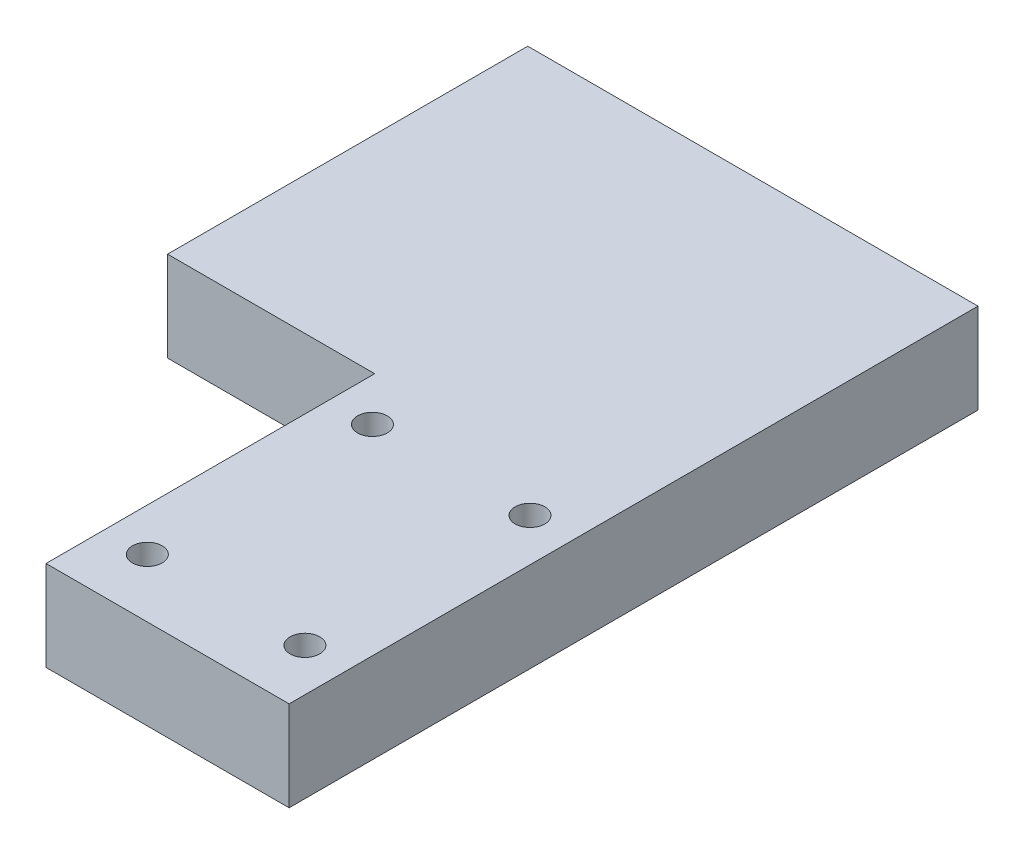
ISO-10303-21;
HEADER;
FILE_DESCRIPTION(('STEP AP214'),'2;1');
FILE_NAME('part.step','',(''),(''),'','','');
FILE_SCHEMA(('AUTOMOTIVE_DESIGN { 1 0 10303 214 1 1 1 1 }'));
ENDSEC;
DATA;
#1=APPLICATION_CONTEXT('core data for automotive mechanical design processes');
#2=APPLICATION_PROTOCOL_DEFINITION('international standard','automotive_design',2000,#1);
#3=PRODUCT_CONTEXT('',#1,'mechanical');
#4=PRODUCT('Part','Part','',(#3));
#5=PRODUCT_RELATED_PRODUCT_CATEGORY('part','',(#4));
#6=PRODUCT_DEFINITION_FORMATION('','',#4);
#7=PRODUCT_DEFINITION_CONTEXT('part definition',#1,'design');
#8=PRODUCT_DEFINITION('design','',#6,#7);
#9=PRODUCT_DEFINITION_SHAPE('','',#8);
#10=(LENGTH_UNIT() NAMED_UNIT(*) SI_UNIT(.MILLI.,.METRE.));
#11=(NAMED_UNIT(*) PLANE_ANGLE_UNIT() SI_UNIT($,.RADIAN.));
#12=(NAMED_UNIT(*) SI_UNIT($,.STERADIAN.) SOLID_ANGLE_UNIT());
#13=UNCERTAINTY_MEASURE_WITH_UNIT(LENGTH_MEASURE(1.E-05),#10,'distance_accuracy_value','');
#14=(GEOMETRIC_REPRESENTATION_CONTEXT(3) GLOBAL_UNCERTAINTY_ASSIGNED_CONTEXT((#13)) GLOBAL_UNIT_ASSIGNED_CONTEXT((#10,
#11,#12)) REPRESENTATION_CONTEXT('',''));
#15=CARTESIAN_POINT('',(0.,0.,0.));
#16=DIRECTION('',(0.,0.,1.));
#17=DIRECTION('',(1.,0.,0.));
#18=AXIS2_PLACEMENT_3D('',#15,#16,#17);
#19=CARTESIAN_POINT('',(50.,10.,76.5));
#20=DIRECTION('',(-1.,0.,0.));
#21=DIRECTION('',(0.,0.,1.));
#22=AXIS2_PLACEMENT_3D('',#19,#20,#21);
#23=PLANE('',#22);
#24=DIRECTION('',(0.,0.,-1.));
#25=VECTOR('',#24,1.);
#26=CARTESIAN_POINT('',(50.,-10.,76.5));
#27=LINE('',#26,#25);
#28=CARTESIAN_POINT('',(50.,-10.,76.5));
#29=VERTEX_POINT('',#28);
#30=CARTESIAN_POINT('',(50.,-10.,-76.5));
#31=VERTEX_POINT('',#30);
#32=EDGE_CURVE('E188',#29,#31,#27,.T.);
#33=ORIENTED_EDGE('',*,*,#32,.T.);
#34=DIRECTION('',(0.,-1.,0.));
#35=VECTOR('',#34,1.);
#36=CARTESIAN_POINT('',(50.,10.,-76.5));
#37=LINE('',#36,#35);
#38=CARTESIAN_POINT('',(50.,10.,-76.5));
#39=VERTEX_POINT('',#38);
#40=EDGE_CURVE('E24',#39,#31,#37,.T.);
#41=ORIENTED_EDGE('',*,*,#40,.F.);
#42=DIRECTION('',(0.,0.,-1.));
#43=VECTOR('',#42,1.);
#44=CARTESIAN_POINT('',(50.,10.,76.5));
#45=LINE('',#44,#43);
#46=CARTESIAN_POINT('',(50.,10.,76.5));
#47=VERTEX_POINT('',#46);
#48=EDGE_CURVE('E189',#47,#39,#45,.T.);
#49=ORIENTED_EDGE('',*,*,#48,.F.);
#50=DIRECTION('',(0.,-1.,0.));
#51=VECTOR('',#50,1.);
#52=CARTESIAN_POINT('',(50.,10.,76.5));
#53=LINE('',#52,#51);
#54=EDGE_CURVE('E196',#47,#29,#53,.T.);
#55=ORIENTED_EDGE('',*,*,#54,.T.);
#56=EDGE_LOOP('',(#33,#41,#49,#55));
#57=FACE_BOUND('',#56,.T.);
#58=ADVANCED_FACE('F17',(#57),#23,.F.);
#59=CARTESIAN_POINT('',(-50.,10.,-76.5));
#60=DIRECTION('',(0.,0.,1.));
#61=DIRECTION('',(1.,0.,0.));
#62=AXIS2_PLACEMENT_3D('',#59,#60,#61);
#63=PLANE('',#62);
#64=DIRECTION('',(-1.,0.,0.));
#65=VECTOR('',#64,1.);
#66=CARTESIAN_POINT('',(-50.,-10.,-76.5));
#67=LINE('',#66,#65);
#68=CARTESIAN_POINT('',(-50.,-10.,-76.5));
#69=VERTEX_POINT('',#68);
#70=EDGE_CURVE('E199',#31,#69,#67,.T.);
#71=ORIENTED_EDGE('',*,*,#70,.T.);
#72=DIRECTION('',(0.,-1.,0.));
#73=VECTOR('',#72,1.);
#74=CARTESIAN_POINT('',(-50.,10.,-76.5));
#75=LINE('',#74,#73);
#76=CARTESIAN_POINT('',(-50.,10.,-76.5));
#77=VERTEX_POINT('',#76);
#78=EDGE_CURVE('E206',#77,#69,#75,.T.);
#79=ORIENTED_EDGE('',*,*,#78,.F.);
#80=DIRECTION('',(-1.,0.,0.));
#81=VECTOR('',#80,1.);
#82=CARTESIAN_POINT('',(-50.,10.,-76.5));
#83=LINE('',#82,#81);
#84=EDGE_CURVE('E63',#39,#77,#83,.T.);
#85=ORIENTED_EDGE('',*,*,#84,.F.);
#86=ORIENTED_EDGE('',*,*,#40,.T.);
#87=EDGE_LOOP('',(#71,#79,#85,#86));
#88=FACE_BOUND('',#87,.T.);
#89=ADVANCED_FACE('F209',(#88),#63,.F.);
#90=CARTESIAN_POINT('',(-50.,10.,76.5));
#91=DIRECTION('',(1.,0.,0.));
#92=DIRECTION('',(0.,0.,-1.));
#93=AXIS2_PLACEMENT_3D('',#90,#91,#92);
#94=PLANE('',#93);
#95=CARTESIAN_POINT('',(-50.,0.,-66.5));
#96=DIRECTION('',(-1.,0.,0.));
#97=DIRECTION('',(0.,0.,1.));
#98=AXIS2_PLACEMENT_3D('',#95,#96,#97);
#99=CIRCLE('',#98,4.);
#100=CARTESIAN_POINT('',(-50.,0.,-62.5));
#101=VERTEX_POINT('',#100);
#102=EDGE_CURVE('E534',#101,#101,#99,.T.);
#103=ORIENTED_EDGE('',*,*,#102,.F.);
#104=EDGE_LOOP('',(#103));
#105=FACE_BOUND('',#104,.T.);
#106=CARTESIAN_POINT('',(-50.,0.,-36.5));
#107=DIRECTION('',(-1.,0.,0.));
#108=DIRECTION('',(0.,0.,1.));
#109=AXIS2_PLACEMENT_3D('',#106,#107,#108);
#110=CIRCLE('',#109,4.);
#111=CARTESIAN_POINT('',(-50.,0.,-32.5));
#112=VERTEX_POINT('',#111);
#113=EDGE_CURVE('E96',#112,#112,#110,.T.);
#114=ORIENTED_EDGE('',*,*,#113,.F.);
#115=EDGE_LOOP('',(#114));
#116=FACE_BOUND('',#115,.T.);
#117=CARTESIAN_POINT('',(-50.,0.,-6.5));
#118=DIRECTION('',(-1.,0.,0.));
#119=DIRECTION('',(0.,0.,1.));
#120=AXIS2_PLACEMENT_3D('',#117,#118,#119);
#121=CIRCLE('',#120,4.);
#122=CARTESIAN_POINT('',(-50.,0.,-2.5));
#123=VERTEX_POINT('',#122);
#124=EDGE_CURVE('E115',#123,#123,#121,.T.);
#125=ORIENTED_EDGE('',*,*,#124,.F.);
#126=EDGE_LOOP('',(#125));
#127=FACE_BOUND('',#126,.T.);
#128=DIRECTION('',(0.,0.,1.));
#129=VECTOR('',#128,1.);
#130=CARTESIAN_POINT('',(-50.,-10.,76.5));
#131=LINE('',#130,#129);
#132=CARTESIAN_POINT('',(-50.,-10.,3.5));
#133=VERTEX_POINT('',#132);
#134=EDGE_CURVE('E201',#69,#133,#131,.T.);
#135=ORIENTED_EDGE('',*,*,#134,.T.);
#136=DIRECTION('',(0.,1.,0.));
#137=VECTOR('',#136,1.);
#138=CARTESIAN_POINT('',(-50.,10.,3.5));
#139=LINE('',#138,#137);
#140=CARTESIAN_POINT('',(-50.,10.,3.5));
#141=VERTEX_POINT('',#140);
#142=EDGE_CURVE('E30',#133,#141,#139,.T.);
#143=ORIENTED_EDGE('',*,*,#142,.T.);
#144=DIRECTION('',(0.,0.,1.));
#145=VECTOR('',#144,1.);
#146=CARTESIAN_POINT('',(-50.,10.,76.5));
#147=LINE('',#146,#145);
#148=EDGE_CURVE('E192',#77,#141,#147,.T.);
#149=ORIENTED_EDGE('',*,*,#148,.F.);
#150=ORIENTED_EDGE('',*,*,#78,.T.);
#151=EDGE_LOOP('',(#135,#143,#149,#150));
#152=FACE_BOUND('',#151,.T.);
#153=ADVANCED_FACE('F218',(#105,#116,#127,#152),#94,.F.);
#154=CARTESIAN_POINT('',(-50.,10.,76.5));
#155=DIRECTION('',(0.,0.,-1.));
#156=DIRECTION('',(-1.,0.,0.));
#157=AXIS2_PLACEMENT_3D('',#154,#155,#156);
#158=PLANE('',#157);
#159=DIRECTION('',(1.,0.,0.));
#160=VECTOR('',#159,1.);
#161=CARTESIAN_POINT('',(-50.,10.,76.5));
#162=LINE('',#161,#160);
#163=CARTESIAN_POINT('',(-4.,10.,76.5));
#164=VERTEX_POINT('',#163);
#165=EDGE_CURVE('E39',#164,#47,#162,.T.);
#166=ORIENTED_EDGE('',*,*,#165,.F.);
#167=DIRECTION('',(0.,-1.,0.));
#168=VECTOR('',#167,1.);
#169=CARTESIAN_POINT('',(-4.,10.,76.5));
#170=LINE('',#169,#168);
#171=CARTESIAN_POINT('',(-4.,-10.,76.5));
#172=VERTEX_POINT('',#171);
#173=EDGE_CURVE('E186',#164,#172,#170,.T.);
#174=ORIENTED_EDGE('',*,*,#173,.T.);
#175=DIRECTION('',(1.,0.,0.));
#176=VECTOR('',#175,1.);
#177=CARTESIAN_POINT('',(-50.,-10.,76.5));
#178=LINE('',#177,#176);
#179=EDGE_CURVE('E57',#172,#29,#178,.T.);
#180=ORIENTED_EDGE('',*,*,#179,.T.);
#181=ORIENTED_EDGE('',*,*,#54,.F.);
#182=EDGE_LOOP('',(#166,#174,#180,#181));
#183=FACE_BOUND('',#182,.T.);
#184=ADVANCED_FACE('F225',(#183),#158,.F.);
#185=CARTESIAN_POINT('',(0.,10.,0.));
#186=DIRECTION('',(0.,-1.,0.));
#187=DIRECTION('',(0.,0.,-1.));
#188=AXIS2_PLACEMENT_3D('',#185,#186,#187);
#189=PLANE('',#188);
#190=CARTESIAN_POINT('',(40.5,10.,63.5));
#191=DIRECTION('',(0.,-1.,0.));
#192=DIRECTION('',(0.,0.,-1.));
#193=AXIS2_PLACEMENT_3D('',#190,#191,#192);
#194=CIRCLE('',#193,3.3);
#195=CARTESIAN_POINT('',(40.5,10.,60.2));
#196=VERTEX_POINT('',#195);
#197=EDGE_CURVE('E136',#196,#196,#194,.T.);
#198=ORIENTED_EDGE('',*,*,#197,.T.);
#199=EDGE_LOOP('',(#198));
#200=FACE_BOUND('',#199,.T.);
#201=CARTESIAN_POINT('',(5.5,10.,63.5));
#202=DIRECTION('',(0.,-1.,0.));
#203=DIRECTION('',(0.,0.,-1.));
#204=AXIS2_PLACEMENT_3D('',#201,#202,#203);
#205=CIRCLE('',#204,3.3);
#206=CARTESIAN_POINT('',(5.5,10.,60.2));
#207=VERTEX_POINT('',#206);
#208=EDGE_CURVE('E148',#207,#207,#205,.T.);
#209=ORIENTED_EDGE('',*,*,#208,.T.);
#210=EDGE_LOOP('',(#209));
#211=FACE_BOUND('',#210,.T.);
#212=CARTESIAN_POINT('',(5.5,10.,13.5));
#213=DIRECTION('',(0.,-1.,0.));
#214=DIRECTION('',(0.,0.,-1.));
#215=AXIS2_PLACEMENT_3D('',#212,#213,#214);
#216=CIRCLE('',#215,3.3);
#217=CARTESIAN_POINT('',(5.5,10.,10.2));
#218=VERTEX_POINT('',#217);
#219=EDGE_CURVE('E160',#218,#218,#216,.T.);
#220=ORIENTED_EDGE('',*,*,#219,.T.);
#221=EDGE_LOOP('',(#220));
#222=FACE_BOUND('',#221,.T.);
#223=CARTESIAN_POINT('',(40.5,10.,13.5));
#224=DIRECTION('',(0.,-1.,0.));
#225=DIRECTION('',(0.,0.,-1.));
#226=AXIS2_PLACEMENT_3D('',#223,#224,#225);
#227=CIRCLE('',#226,3.3);
#228=CARTESIAN_POINT('',(40.5,10.,10.2));
#229=VERTEX_POINT('',#228);
#230=EDGE_CURVE('E172',#229,#229,#227,.T.);
#231=ORIENTED_EDGE('',*,*,#230,.T.);
#232=EDGE_LOOP('',(#231));
#233=FACE_BOUND('',#232,.T.);
#234=DIRECTION('',(1.,0.,0.));
#235=VECTOR('',#234,1.);
#236=CARTESIAN_POINT('',(-96.,10.,3.5));
#237=LINE('',#236,#235);
#238=CARTESIAN_POINT('',(-4.,10.,3.5));
#239=VERTEX_POINT('',#238);
#240=EDGE_CURVE('E178',#141,#239,#237,.T.);
#241=ORIENTED_EDGE('',*,*,#240,.T.);
#242=DIRECTION('',(0.,0.,1.));
#243=VECTOR('',#242,1.);
#244=CARTESIAN_POINT('',(-4.,10.,149.5));
#245=LINE('',#244,#243);
#246=EDGE_CURVE('E176',#239,#164,#245,.T.);
#247=ORIENTED_EDGE('',*,*,#246,.T.);
#248=ORIENTED_EDGE('',*,*,#165,.T.);
#249=ORIENTED_EDGE('',*,*,#48,.T.);
#250=ORIENTED_EDGE('',*,*,#84,.T.);
#251=ORIENTED_EDGE('',*,*,#148,.T.);
#252=EDGE_LOOP('',(#241,#247,#248,#249,#250,#251));
#253=FACE_BOUND('',#252,.T.);
#254=ADVANCED_FACE('F220',(#200,#211,#222,#233,#253),#189,.F.);
#255=CARTESIAN_POINT('',(0.,-10.,0.));
#256=DIRECTION('',(0.,-1.,0.));
#257=DIRECTION('',(0.,0.,-1.));
#258=AXIS2_PLACEMENT_3D('',#255,#256,#257);
#259=PLANE('',#258);
#260=CARTESIAN_POINT('',(40.5,-10.,63.5));
#261=DIRECTION('',(0.,-1.,0.));
#262=DIRECTION('',(0.,0.,-1.));
#263=AXIS2_PLACEMENT_3D('',#260,#261,#262);
#264=CIRCLE('',#263,5.5);
#265=CARTESIAN_POINT('',(40.5,-10.,58.));
#266=VERTEX_POINT('',#265);
#267=EDGE_CURVE('E127',#266,#266,#264,.T.);
#268=ORIENTED_EDGE('',*,*,#267,.F.);
#269=EDGE_LOOP('',(#268));
#270=FACE_BOUND('',#269,.T.);
#271=CARTESIAN_POINT('',(5.5,-10.,63.5));
#272=DIRECTION('',(0.,-1.,0.));
#273=DIRECTION('',(0.,0.,-1.));
#274=AXIS2_PLACEMENT_3D('',#271,#272,#273);
#275=CIRCLE('',#274,5.5);
#276=CARTESIAN_POINT('',(5.5,-10.,58.));
#277=VERTEX_POINT('',#276);
#278=EDGE_CURVE('E139',#277,#277,#275,.T.);
#279=ORIENTED_EDGE('',*,*,#278,.F.);
#280=EDGE_LOOP('',(#279));
#281=FACE_BOUND('',#280,.T.);
#282=CARTESIAN_POINT('',(5.5,-10.,13.5));
#283=DIRECTION('',(0.,-1.,0.));
#284=DIRECTION('',(0.,0.,-1.));
#285=AXIS2_PLACEMENT_3D('',#282,#283,#284);
#286=CIRCLE('',#285,5.5);
#287=CARTESIAN_POINT('',(5.5,-10.,8.));
#288=VERTEX_POINT('',#287);
#289=EDGE_CURVE('E151',#288,#288,#286,.T.);
#290=ORIENTED_EDGE('',*,*,#289,.F.);
#291=EDGE_LOOP('',(#290));
#292=FACE_BOUND('',#291,.T.);
#293=CARTESIAN_POINT('',(40.5,-10.,13.5));
#294=DIRECTION('',(0.,-1.,0.));
#295=DIRECTION('',(0.,0.,-1.));
#296=AXIS2_PLACEMENT_3D('',#293,#294,#295);
#297=CIRCLE('',#296,5.5);
#298=CARTESIAN_POINT('',(40.5,-10.,8.));
#299=VERTEX_POINT('',#298);
#300=EDGE_CURVE('E163',#299,#299,#297,.T.);
#301=ORIENTED_EDGE('',*,*,#300,.F.);
#302=EDGE_LOOP('',(#301));
#303=FACE_BOUND('',#302,.T.);
#304=DIRECTION('',(0.,0.,1.));
#305=VECTOR('',#304,1.);
#306=CARTESIAN_POINT('',(-4.,-10.,149.5));
#307=LINE('',#306,#305);
#308=CARTESIAN_POINT('',(-4.,-10.,3.5));
#309=VERTEX_POINT('',#308);
#310=EDGE_CURVE('E175',#309,#172,#307,.T.);
#311=ORIENTED_EDGE('',*,*,#310,.F.);
#312=DIRECTION('',(1.,0.,0.));
#313=VECTOR('',#312,1.);
#314=CARTESIAN_POINT('',(0.,-10.,3.5));
#315=LINE('',#314,#313);
#316=EDGE_CURVE('E11',#133,#309,#315,.T.);
#317=ORIENTED_EDGE('',*,*,#316,.F.);
#318=ORIENTED_EDGE('',*,*,#134,.F.);
#319=ORIENTED_EDGE('',*,*,#70,.F.);
#320=ORIENTED_EDGE('',*,*,#32,.F.);
#321=ORIENTED_EDGE('',*,*,#179,.F.);
#322=EDGE_LOOP('',(#311,#317,#318,#319,#320,#321));
#323=FACE_BOUND('',#322,.T.);
#324=ADVANCED_FACE('F215',(#270,#281,#292,#303,#323),#259,.T.);
#325=CARTESIAN_POINT('',(-4.,10.,149.5));
#326=DIRECTION('',(1.,0.,0.));
#327=DIRECTION('',(0.,0.,-1.));
#328=AXIS2_PLACEMENT_3D('',#325,#326,#327);
#329=PLANE('',#328);
#330=ORIENTED_EDGE('',*,*,#246,.F.);
#331=DIRECTION('',(0.,-1.,0.));
#332=VECTOR('',#331,1.);
#333=CARTESIAN_POINT('',(-4.,10.,3.5));
#334=LINE('',#333,#332);
#335=EDGE_CURVE('E181',#239,#309,#334,.T.);
#336=ORIENTED_EDGE('',*,*,#335,.T.);
#337=ORIENTED_EDGE('',*,*,#310,.T.);
#338=ORIENTED_EDGE('',*,*,#173,.F.);
#339=EDGE_LOOP('',(#330,#336,#337,#338));
#340=FACE_BOUND('',#339,.T.);
#341=ADVANCED_FACE('F224',(#340),#329,.F.);
#342=CARTESIAN_POINT('',(-96.,10.,3.5));
#343=DIRECTION('',(0.,0.,-1.));
#344=DIRECTION('',(-1.,0.,0.));
#345=AXIS2_PLACEMENT_3D('',#342,#343,#344);
#346=PLANE('',#345);
#347=ORIENTED_EDGE('',*,*,#316,.T.);
#348=ORIENTED_EDGE('',*,*,#335,.F.);
#349=ORIENTED_EDGE('',*,*,#240,.F.);
#350=ORIENTED_EDGE('',*,*,#142,.F.);
#351=EDGE_LOOP('',(#347,#348,#349,#350));
#352=FACE_BOUND('',#351,.T.);
#353=ADVANCED_FACE('F222',(#352),#346,.F.);
#354=CARTESIAN_POINT('',(40.5,-10.,13.5));
#355=DIRECTION('',(0.,-1.,0.));
#356=DIRECTION('',(0.,0.,-1.));
#357=AXIS2_PLACEMENT_3D('',#354,#355,#356);
#358=CYLINDRICAL_SURFACE('',#357,3.3);
#359=ORIENTED_EDGE('',*,*,#230,.F.);
#360=EDGE_LOOP('',(#359));
#361=FACE_BOUND('',#360,.T.);
#362=CARTESIAN_POINT('',(40.5,-3.2,13.5));
#363=DIRECTION('',(0.,-1.,0.));
#364=DIRECTION('',(0.,0.,-1.));
#365=AXIS2_PLACEMENT_3D('',#362,#363,#364);
#366=CIRCLE('',#365,3.3);
#367=CARTESIAN_POINT('',(40.5,-3.2,10.2));
#368=VERTEX_POINT('',#367);
#369=EDGE_CURVE('E169',#368,#368,#366,.T.);
#370=ORIENTED_EDGE('',*,*,#369,.T.);
#371=EDGE_LOOP('',(#370));
#372=FACE_BOUND('',#371,.T.);
#373=ADVANCED_FACE('F292',(#361,#372),#358,.F.);
#374=CARTESIAN_POINT('',(43.8,-3.2,13.5));
#375=DIRECTION('',(0.,1.,0.));
#376=DIRECTION('',(0.,0.,1.));
#377=AXIS2_PLACEMENT_3D('',#374,#375,#376);
#378=PLANE('',#377);
#379=ORIENTED_EDGE('',*,*,#369,.F.);
#380=EDGE_LOOP('',(#379));
#381=FACE_BOUND('',#380,.T.);
#382=CARTESIAN_POINT('',(40.5,-3.2,13.5));
#383=DIRECTION('',(0.,-1.,0.));
#384=DIRECTION('',(0.,0.,-1.));
#385=AXIS2_PLACEMENT_3D('',#382,#383,#384);
#386=CIRCLE('',#385,5.5);
#387=CARTESIAN_POINT('',(40.5,-3.2,8.));
#388=VERTEX_POINT('',#387);
#389=EDGE_CURVE('E166',#388,#388,#386,.T.);
#390=ORIENTED_EDGE('',*,*,#389,.T.);
#391=EDGE_LOOP('',(#390));
#392=FACE_BOUND('',#391,.T.);
#393=ADVANCED_FACE('F301',(#381,#392),#378,.F.);
#394=CARTESIAN_POINT('',(40.5,-10.,13.5));
#395=DIRECTION('',(0.,-1.,0.));
#396=DIRECTION('',(0.,0.,-1.));
#397=AXIS2_PLACEMENT_3D('',#394,#395,#396);
#398=CYLINDRICAL_SURFACE('',#397,5.5);
#399=ORIENTED_EDGE('',*,*,#389,.F.);
#400=EDGE_LOOP('',(#399));
#401=FACE_BOUND('',#400,.T.);
#402=ORIENTED_EDGE('',*,*,#300,.T.);
#403=EDGE_LOOP('',(#402));
#404=FACE_BOUND('',#403,.T.);
#405=ADVANCED_FACE('F311',(#401,#404),#398,.F.);
#406=CARTESIAN_POINT('',(5.5,-10.,13.5));
#407=DIRECTION('',(0.,-1.,0.));
#408=DIRECTION('',(0.,0.,-1.));
#409=AXIS2_PLACEMENT_3D('',#406,#407,#408);
#410=CYLINDRICAL_SURFACE('',#409,3.3);
#411=ORIENTED_EDGE('',*,*,#219,.F.);
#412=EDGE_LOOP('',(#411));
#413=FACE_BOUND('',#412,.T.);
#414=CARTESIAN_POINT('',(5.5,-3.2,13.5));
#415=DIRECTION('',(0.,-1.,0.));
#416=DIRECTION('',(0.,0.,-1.));
#417=AXIS2_PLACEMENT_3D('',#414,#415,#416);
#418=CIRCLE('',#417,3.3);
#419=CARTESIAN_POINT('',(5.5,-3.2,10.2));
#420=VERTEX_POINT('',#419);
#421=EDGE_CURVE('E157',#420,#420,#418,.T.);
#422=ORIENTED_EDGE('',*,*,#421,.T.);
#423=EDGE_LOOP('',(#422));
#424=FACE_BOUND('',#423,.T.);
#425=ADVANCED_FACE('F321',(#413,#424),#410,.F.);
#426=CARTESIAN_POINT('',(8.8,-3.2,13.5));
#427=DIRECTION('',(0.,1.,0.));
#428=DIRECTION('',(0.,0.,1.));
#429=AXIS2_PLACEMENT_3D('',#426,#427,#428);
#430=PLANE('',#429);
#431=ORIENTED_EDGE('',*,*,#421,.F.);
#432=EDGE_LOOP('',(#431));
#433=FACE_BOUND('',#432,.T.);
#434=CARTESIAN_POINT('',(5.5,-3.2,13.5));
#435=DIRECTION('',(0.,-1.,0.));
#436=DIRECTION('',(0.,0.,-1.));
#437=AXIS2_PLACEMENT_3D('',#434,#435,#436);
#438=CIRCLE('',#437,5.5);
#439=CARTESIAN_POINT('',(5.5,-3.2,8.));
#440=VERTEX_POINT('',#439);
#441=EDGE_CURVE('E154',#440,#440,#438,.T.);
#442=ORIENTED_EDGE('',*,*,#441,.T.);
#443=EDGE_LOOP('',(#442));
#444=FACE_BOUND('',#443,.T.);
#445=ADVANCED_FACE('F331',(#433,#444),#430,.F.);
#446=CARTESIAN_POINT('',(5.5,-10.,13.5));
#447=DIRECTION('',(0.,-1.,0.));
#448=DIRECTION('',(0.,0.,-1.));
#449=AXIS2_PLACEMENT_3D('',#446,#447,#448);
#450=CYLINDRICAL_SURFACE('',#449,5.5);
#451=ORIENTED_EDGE('',*,*,#441,.F.);
#452=EDGE_LOOP('',(#451));
#453=FACE_BOUND('',#452,.T.);
#454=ORIENTED_EDGE('',*,*,#289,.T.);
#455=EDGE_LOOP('',(#454));
#456=FACE_BOUND('',#455,.T.);
#457=ADVANCED_FACE('F341',(#453,#456),#450,.F.);
#458=CARTESIAN_POINT('',(5.5,-10.,63.5));
#459=DIRECTION('',(0.,-1.,0.));
#460=DIRECTION('',(0.,0.,-1.));
#461=AXIS2_PLACEMENT_3D('',#458,#459,#460);
#462=CYLINDRICAL_SURFACE('',#461,3.3);
#463=ORIENTED_EDGE('',*,*,#208,.F.);
#464=EDGE_LOOP('',(#463));
#465=FACE_BOUND('',#464,.T.);
#466=CARTESIAN_POINT('',(5.5,-3.2,63.5));
#467=DIRECTION('',(0.,-1.,0.));
#468=DIRECTION('',(0.,0.,-1.));
#469=AXIS2_PLACEMENT_3D('',#466,#467,#468);
#470=CIRCLE('',#469,3.3);
#471=CARTESIAN_POINT('',(5.5,-3.2,60.2));
#472=VERTEX_POINT('',#471);
#473=EDGE_CURVE('E145',#472,#472,#470,.T.);
#474=ORIENTED_EDGE('',*,*,#473,.T.);
#475=EDGE_LOOP('',(#474));
#476=FACE_BOUND('',#475,.T.);
#477=ADVANCED_FACE('F351',(#465,#476),#462,.F.);
#478=CARTESIAN_POINT('',(8.8,-3.2,63.5));
#479=DIRECTION('',(0.,1.,0.));
#480=DIRECTION('',(0.,0.,1.));
#481=AXIS2_PLACEMENT_3D('',#478,#479,#480);
#482=PLANE('',#481);
#483=ORIENTED_EDGE('',*,*,#473,.F.);
#484=EDGE_LOOP('',(#483));
#485=FACE_BOUND('',#484,.T.);
#486=CARTESIAN_POINT('',(5.5,-3.2,63.5));
#487=DIRECTION('',(0.,-1.,0.));
#488=DIRECTION('',(0.,0.,-1.));
#489=AXIS2_PLACEMENT_3D('',#486,#487,#488);
#490=CIRCLE('',#489,5.5);
#491=CARTESIAN_POINT('',(5.5,-3.2,58.));
#492=VERTEX_POINT('',#491);
#493=EDGE_CURVE('E142',#492,#492,#490,.T.);
#494=ORIENTED_EDGE('',*,*,#493,.T.);
#495=EDGE_LOOP('',(#494));
#496=FACE_BOUND('',#495,.T.);
#497=ADVANCED_FACE('F361',(#485,#496),#482,.F.);
#498=CARTESIAN_POINT('',(5.5,-10.,63.5));
#499=DIRECTION('',(0.,-1.,0.));
#500=DIRECTION('',(0.,0.,-1.));
#501=AXIS2_PLACEMENT_3D('',#498,#499,#500);
#502=CYLINDRICAL_SURFACE('',#501,5.5);
#503=ORIENTED_EDGE('',*,*,#493,.F.);
#504=EDGE_LOOP('',(#503));
#505=FACE_BOUND('',#504,.T.);
#506=ORIENTED_EDGE('',*,*,#278,.T.);
#507=EDGE_LOOP('',(#506));
#508=FACE_BOUND('',#507,.T.);
#509=ADVANCED_FACE('F371',(#505,#508),#502,.F.);
#510=CARTESIAN_POINT('',(40.5,-10.,63.5));
#511=DIRECTION('',(0.,-1.,0.));
#512=DIRECTION('',(0.,0.,-1.));
#513=AXIS2_PLACEMENT_3D('',#510,#511,#512);
#514=CYLINDRICAL_SURFACE('',#513,3.3);
#515=ORIENTED_EDGE('',*,*,#197,.F.);
#516=EDGE_LOOP('',(#515));
#517=FACE_BOUND('',#516,.T.);
#518=CARTESIAN_POINT('',(40.5,-3.2,63.5));
#519=DIRECTION('',(0.,-1.,0.));
#520=DIRECTION('',(0.,0.,-1.));
#521=AXIS2_PLACEMENT_3D('',#518,#519,#520);
#522=CIRCLE('',#521,3.3);
#523=CARTESIAN_POINT('',(40.5,-3.2,60.2));
#524=VERTEX_POINT('',#523);
#525=EDGE_CURVE('E133',#524,#524,#522,.T.);
#526=ORIENTED_EDGE('',*,*,#525,.T.);
#527=EDGE_LOOP('',(#526));
#528=FACE_BOUND('',#527,.T.);
#529=ADVANCED_FACE('F381',(#517,#528),#514,.F.);
#530=CARTESIAN_POINT('',(43.8,-3.2,63.5));
#531=DIRECTION('',(0.,1.,0.));
#532=DIRECTION('',(0.,0.,1.));
#533=AXIS2_PLACEMENT_3D('',#530,#531,#532);
#534=PLANE('',#533);
#535=ORIENTED_EDGE('',*,*,#525,.F.);
#536=EDGE_LOOP('',(#535));
#537=FACE_BOUND('',#536,.T.);
#538=CARTESIAN_POINT('',(40.5,-3.2,63.5));
#539=DIRECTION('',(0.,-1.,0.));
#540=DIRECTION('',(0.,0.,-1.));
#541=AXIS2_PLACEMENT_3D('',#538,#539,#540);
#542=CIRCLE('',#541,5.5);
#543=CARTESIAN_POINT('',(40.5,-3.2,58.));
#544=VERTEX_POINT('',#543);
#545=EDGE_CURVE('E130',#544,#544,#542,.T.);
#546=ORIENTED_EDGE('',*,*,#545,.T.);
#547=EDGE_LOOP('',(#546));
#548=FACE_BOUND('',#547,.T.);
#549=ADVANCED_FACE('F391',(#537,#548),#534,.F.);
#550=CARTESIAN_POINT('',(40.5,-10.,63.5));
#551=DIRECTION('',(0.,-1.,0.));
#552=DIRECTION('',(0.,0.,-1.));
#553=AXIS2_PLACEMENT_3D('',#550,#551,#552);
#554=CYLINDRICAL_SURFACE('',#553,5.5);
#555=ORIENTED_EDGE('',*,*,#545,.F.);
#556=EDGE_LOOP('',(#555));
#557=FACE_BOUND('',#556,.T.);
#558=ORIENTED_EDGE('',*,*,#267,.T.);
#559=EDGE_LOOP('',(#558));
#560=FACE_BOUND('',#559,.T.);
#561=ADVANCED_FACE('F401',(#557,#560),#554,.F.);
#562=CARTESIAN_POINT('',(-30.25,0.,-6.5));
#563=DIRECTION('',(-1.,0.,0.));
#564=DIRECTION('',(0.,0.,1.));
#565=AXIS2_PLACEMENT_3D('',#562,#563,#564);
#566=CONICAL_SURFACE('',#565,3.4,1.02974425867665);
#567=CARTESIAN_POINT('',(-28.2070738953063,0.,-6.5));
#568=VERTEX_POINT('',#567);
#569=VERTEX_LOOP('',#568);
#570=FACE_BOUND('',#569,.T.);
#571=CARTESIAN_POINT('',(-30.25,0.,-6.5));
#572=DIRECTION('',(-1.,0.,0.));
#573=DIRECTION('',(0.,0.,1.));
#574=AXIS2_PLACEMENT_3D('',#571,#572,#573);
#575=CIRCLE('',#574,3.4);
#576=CARTESIAN_POINT('',(-30.25,0.,-3.1));
#577=VERTEX_POINT('',#576);
#578=EDGE_CURVE('E124',#577,#577,#575,.T.);
#579=ORIENTED_EDGE('',*,*,#578,.T.);
#580=EDGE_LOOP('',(#579));
#581=FACE_BOUND('',#580,.T.);
#582=ADVANCED_FACE('F411',(#570,#581),#566,.F.);
#583=CARTESIAN_POINT('',(-50.,0.,-6.5));
#584=DIRECTION('',(-1.,0.,0.));
#585=DIRECTION('',(0.,0.,1.));
#586=AXIS2_PLACEMENT_3D('',#583,#584,#585);
#587=CYLINDRICAL_SURFACE('',#586,3.4);
#588=ORIENTED_EDGE('',*,*,#578,.F.);
#589=EDGE_LOOP('',(#588));
#590=FACE_BOUND('',#589,.T.);
#591=CARTESIAN_POINT('',(-34.,0.,-6.5));
#592=DIRECTION('',(-1.,0.,0.));
#593=DIRECTION('',(0.,0.,1.));
#594=AXIS2_PLACEMENT_3D('',#591,#592,#593);
#595=CIRCLE('',#594,3.4);
#596=CARTESIAN_POINT('',(-34.,0.,-3.1));
#597=VERTEX_POINT('',#596);
#598=EDGE_CURVE('E121',#597,#597,#595,.T.);
#599=ORIENTED_EDGE('',*,*,#598,.T.);
#600=EDGE_LOOP('',(#599));
#601=FACE_BOUND('',#600,.T.);
#602=ADVANCED_FACE('F422',(#590,#601),#587,.F.);
#603=CARTESIAN_POINT('',(-34.,3.4,-6.5));
#604=DIRECTION('',(1.,0.,0.));
#605=DIRECTION('',(0.,0.,-1.));
#606=AXIS2_PLACEMENT_3D('',#603,#604,#605);
#607=PLANE('',#606);
#608=ORIENTED_EDGE('',*,*,#598,.F.);
#609=EDGE_LOOP('',(#608));
#610=FACE_BOUND('',#609,.T.);
#611=CARTESIAN_POINT('',(-34.,0.,-6.5));
#612=DIRECTION('',(-1.,0.,0.));
#613=DIRECTION('',(0.,0.,1.));
#614=AXIS2_PLACEMENT_3D('',#611,#612,#613);
#615=CIRCLE('',#614,4.);
#616=CARTESIAN_POINT('',(-34.,0.,-2.5));
#617=VERTEX_POINT('',#616);
#618=EDGE_CURVE('E118',#617,#617,#615,.T.);
#619=ORIENTED_EDGE('',*,*,#618,.T.);
#620=EDGE_LOOP('',(#619));
#621=FACE_BOUND('',#620,.T.);
#622=ADVANCED_FACE('F432',(#610,#621),#607,.F.);
#623=CARTESIAN_POINT('',(-50.,0.,-6.5));
#624=DIRECTION('',(-1.,0.,0.));
#625=DIRECTION('',(0.,0.,1.));
#626=AXIS2_PLACEMENT_3D('',#623,#624,#625);
#627=CYLINDRICAL_SURFACE('',#626,4.);
#628=ORIENTED_EDGE('',*,*,#618,.F.);
#629=EDGE_LOOP('',(#628));
#630=FACE_BOUND('',#629,.T.);
#631=ORIENTED_EDGE('',*,*,#124,.T.);
#632=EDGE_LOOP('',(#631));
#633=FACE_BOUND('',#632,.T.);
#634=ADVANCED_FACE('F442',(#630,#633),#627,.F.);
#635=CARTESIAN_POINT('',(-30.25,0.,-36.5));
#636=DIRECTION('',(-1.,0.,0.));
#637=DIRECTION('',(0.,0.,1.));
#638=AXIS2_PLACEMENT_3D('',#635,#636,#637);
#639=CONICAL_SURFACE('',#638,3.4,1.02974425867665);
#640=CARTESIAN_POINT('',(-28.2070738953063,0.,-36.5));
#641=VERTEX_POINT('',#640);
#642=VERTEX_LOOP('',#641);
#643=FACE_BOUND('',#642,.T.);
#644=CARTESIAN_POINT('',(-30.25,0.,-36.5));
#645=DIRECTION('',(-1.,0.,0.));
#646=DIRECTION('',(0.,0.,1.));
#647=AXIS2_PLACEMENT_3D('',#644,#645,#646);
#648=CIRCLE('',#647,3.4);
#649=CARTESIAN_POINT('',(-30.25,0.,-33.1));
#650=VERTEX_POINT('',#649);
#651=EDGE_CURVE('E112',#650,#650,#648,.T.);
#652=ORIENTED_EDGE('',*,*,#651,.T.);
#653=EDGE_LOOP('',(#652));
#654=FACE_BOUND('',#653,.T.);
#655=ADVANCED_FACE('F452',(#643,#654),#639,.F.);
#656=CARTESIAN_POINT('',(-50.,0.,-36.5));
#657=DIRECTION('',(-1.,0.,0.));
#658=DIRECTION('',(0.,0.,1.));
#659=AXIS2_PLACEMENT_3D('',#656,#657,#658);
#660=CYLINDRICAL_SURFACE('',#659,3.4);
#661=ORIENTED_EDGE('',*,*,#651,.F.);
#662=EDGE_LOOP('',(#661));
#663=FACE_BOUND('',#662,.T.);
#664=CARTESIAN_POINT('',(-34.,0.,-36.5));
#665=DIRECTION('',(-1.,0.,0.));
#666=DIRECTION('',(0.,0.,1.));
#667=AXIS2_PLACEMENT_3D('',#664,#665,#666);
#668=CIRCLE('',#667,3.4);
#669=CARTESIAN_POINT('',(-34.,0.,-33.1));
#670=VERTEX_POINT('',#669);
#671=EDGE_CURVE('E109',#670,#670,#668,.T.);
#672=ORIENTED_EDGE('',*,*,#671,.T.);
#673=EDGE_LOOP('',(#672));
#674=FACE_BOUND('',#673,.T.);
#675=ADVANCED_FACE('F462',(#663,#674),#660,.F.);
#676=CARTESIAN_POINT('',(-34.,3.4,-36.5));
#677=DIRECTION('',(1.,0.,0.));
#678=DIRECTION('',(0.,0.,-1.));
#679=AXIS2_PLACEMENT_3D('',#676,#677,#678);
#680=PLANE('',#679);
#681=ORIENTED_EDGE('',*,*,#671,.F.);
#682=EDGE_LOOP('',(#681));
#683=FACE_BOUND('',#682,.T.);
#684=CARTESIAN_POINT('',(-34.,0.,-36.5));
#685=DIRECTION('',(-1.,0.,0.));
#686=DIRECTION('',(0.,0.,1.));
#687=AXIS2_PLACEMENT_3D('',#684,#685,#686);
#688=CIRCLE('',#687,4.);
#689=CARTESIAN_POINT('',(-34.,0.,-32.5));
#690=VERTEX_POINT('',#689);
#691=EDGE_CURVE('E100',#690,#690,#688,.T.);
#692=ORIENTED_EDGE('',*,*,#691,.T.);
#693=EDGE_LOOP('',(#692));
#694=FACE_BOUND('',#693,.T.);
#695=ADVANCED_FACE('F472',(#683,#694),#680,.F.);
#696=CARTESIAN_POINT('',(-50.,0.,-36.5));
#697=DIRECTION('',(-1.,0.,0.));
#698=DIRECTION('',(0.,0.,1.));
#699=AXIS2_PLACEMENT_3D('',#696,#697,#698);
#700=CYLINDRICAL_SURFACE('',#699,4.);
#701=ORIENTED_EDGE('',*,*,#691,.F.);
#702=EDGE_LOOP('',(#701));
#703=FACE_BOUND('',#702,.T.);
#704=ORIENTED_EDGE('',*,*,#113,.T.);
#705=EDGE_LOOP('',(#704));
#706=FACE_BOUND('',#705,.T.);
#707=ADVANCED_FACE('F90',(#703,#706),#700,.F.);
#708=CARTESIAN_POINT('',(-30.25,0.,-66.5));
#709=DIRECTION('',(-1.,0.,0.));
#710=DIRECTION('',(0.,0.,1.));
#711=AXIS2_PLACEMENT_3D('',#708,#709,#710);
#712=CONICAL_SURFACE('',#711,3.4,1.02974425867665);
#713=CARTESIAN_POINT('',(-28.2070738953063,0.,-66.5));
#714=VERTEX_POINT('',#713);
#715=VERTEX_LOOP('',#714);
#716=FACE_BOUND('',#715,.T.);
#717=CARTESIAN_POINT('',(-30.25,0.,-66.5));
#718=DIRECTION('',(-1.,0.,0.));
#719=DIRECTION('',(0.,0.,1.));
#720=AXIS2_PLACEMENT_3D('',#717,#718,#719);
#721=CIRCLE('',#720,3.4);
#722=CARTESIAN_POINT('',(-30.25,0.,-63.1));
#723=VERTEX_POINT('',#722);
#724=EDGE_CURVE('E94',#723,#723,#721,.T.);
#725=ORIENTED_EDGE('',*,*,#724,.T.);
#726=EDGE_LOOP('',(#725));
#727=FACE_BOUND('',#726,.T.);
#728=ADVANCED_FACE('F86',(#716,#727),#712,.F.);
#729=CARTESIAN_POINT('',(-50.,0.,-66.5));
#730=DIRECTION('',(-1.,0.,0.));
#731=DIRECTION('',(0.,0.,1.));
#732=AXIS2_PLACEMENT_3D('',#729,#730,#731);
#733=CYLINDRICAL_SURFACE('',#732,3.4);
#734=ORIENTED_EDGE('',*,*,#724,.F.);
#735=EDGE_LOOP('',(#734));
#736=FACE_BOUND('',#735,.T.);
#737=CARTESIAN_POINT('',(-34.,0.,-66.5));
#738=DIRECTION('',(-1.,0.,0.));
#739=DIRECTION('',(0.,0.,1.));
#740=AXIS2_PLACEMENT_3D('',#737,#738,#739);
#741=CIRCLE('',#740,3.4);
#742=CARTESIAN_POINT('',(-34.,0.,-63.1));
#743=VERTEX_POINT('',#742);
#744=EDGE_CURVE('E97',#743,#743,#741,.T.);
#745=ORIENTED_EDGE('',*,*,#744,.T.);
#746=EDGE_LOOP('',(#745));
#747=FACE_BOUND('',#746,.T.);
#748=ADVANCED_FACE('F89',(#736,#747),#733,.F.);
#749=CARTESIAN_POINT('',(-34.,3.4,-66.5));
#750=DIRECTION('',(1.,0.,0.));
#751=DIRECTION('',(0.,0.,-1.));
#752=AXIS2_PLACEMENT_3D('',#749,#750,#751);
#753=PLANE('',#752);
#754=ORIENTED_EDGE('',*,*,#744,.F.);
#755=EDGE_LOOP('',(#754));
#756=FACE_BOUND('',#755,.T.);
#757=CARTESIAN_POINT('',(-34.,0.,-66.5));
#758=DIRECTION('',(-1.,0.,0.));
#759=DIRECTION('',(0.,0.,1.));
#760=AXIS2_PLACEMENT_3D('',#757,#758,#759);
#761=CIRCLE('',#760,4.);
#762=CARTESIAN_POINT('',(-34.,0.,-62.5));
#763=VERTEX_POINT('',#762);
#764=EDGE_CURVE('E103',#763,#763,#761,.T.);
#765=ORIENTED_EDGE('',*,*,#764,.T.);
#766=EDGE_LOOP('',(#765));
#767=FACE_BOUND('',#766,.T.);
#768=ADVANCED_FACE('F505',(#756,#767),#753,.F.);
#769=CARTESIAN_POINT('',(-50.,0.,-66.5));
#770=DIRECTION('',(-1.,0.,0.));
#771=DIRECTION('',(0.,0.,1.));
#772=AXIS2_PLACEMENT_3D('',#769,#770,#771);
#773=CYLINDRICAL_SURFACE('',#772,4.);
#774=ORIENTED_EDGE('',*,*,#764,.F.);
#775=EDGE_LOOP('',(#774));
#776=FACE_BOUND('',#775,.T.);
#777=ORIENTED_EDGE('',*,*,#102,.T.);
#778=EDGE_LOOP('',(#777));
#779=FACE_BOUND('',#778,.T.);
#780=ADVANCED_FACE('F514',(#776,#779),#773,.F.);
#781=CLOSED_SHELL('',(#58,#89,#153,#184,#254,#324,#341,#353,#373,#393,#405,#425,#445,#457,#477,
#497,#509,#529,#549,#561,#582,#602,#622,#634,#655,#675,#695,#707,#728,#748,#768,#780));
#782=MANIFOLD_SOLID_BREP('B1',#781);
#783=ADVANCED_BREP_SHAPE_REPRESENTATION('',(#18,#782),#14);
#784=SHAPE_DEFINITION_REPRESENTATION(#9,#783);
ENDSEC;
END-ISO-10303-21;
